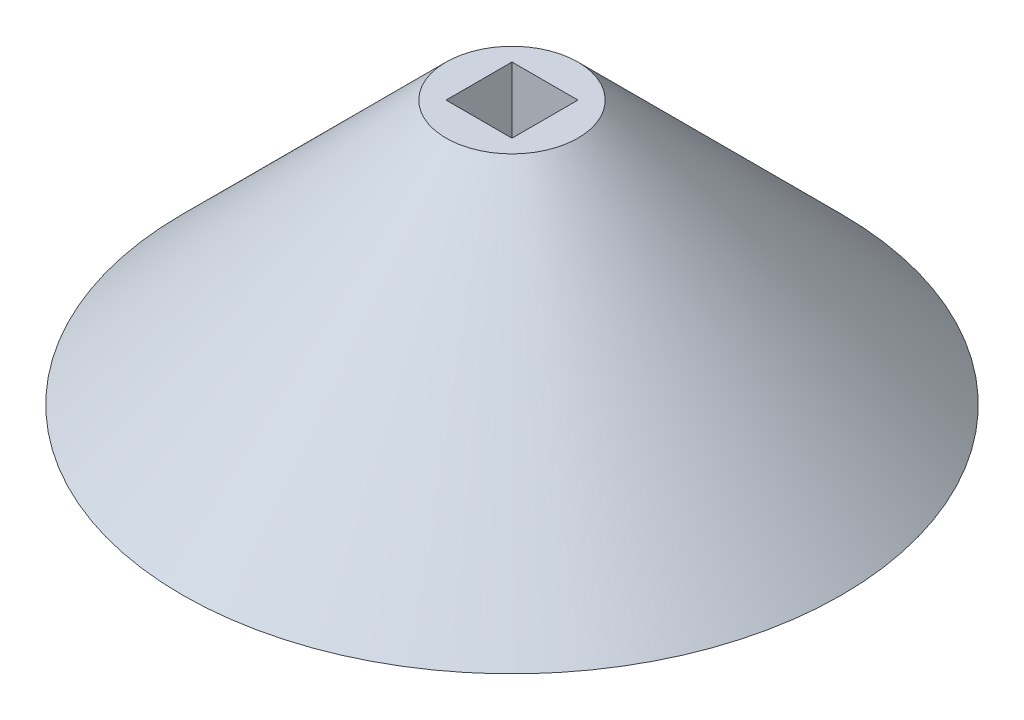
ISO-10303-21;
HEADER;
FILE_DESCRIPTION(('STEP AP214'),'2;1');
FILE_NAME('part.step','',(''),(''),'','','');
FILE_SCHEMA(('AUTOMOTIVE_DESIGN { 1 0 10303 214 1 1 1 1 }'));
ENDSEC;
DATA;
#1=APPLICATION_CONTEXT('core data for automotive mechanical design processes');
#2=APPLICATION_PROTOCOL_DEFINITION('international standard','automotive_design',2000,#1);
#3=PRODUCT_CONTEXT('',#1,'mechanical');
#4=PRODUCT('Part','Part','',(#3));
#5=PRODUCT_RELATED_PRODUCT_CATEGORY('part','',(#4));
#6=PRODUCT_DEFINITION_FORMATION('','',#4);
#7=PRODUCT_DEFINITION_CONTEXT('part definition',#1,'design');
#8=PRODUCT_DEFINITION('design','',#6,#7);
#9=PRODUCT_DEFINITION_SHAPE('','',#8);
#10=(LENGTH_UNIT() NAMED_UNIT(*) SI_UNIT(.MILLI.,.METRE.));
#11=(NAMED_UNIT(*) PLANE_ANGLE_UNIT() SI_UNIT($,.RADIAN.));
#12=(NAMED_UNIT(*) SI_UNIT($,.STERADIAN.) SOLID_ANGLE_UNIT());
#13=UNCERTAINTY_MEASURE_WITH_UNIT(LENGTH_MEASURE(1.E-05),#10,'distance_accuracy_value','');
#14=(GEOMETRIC_REPRESENTATION_CONTEXT(3) GLOBAL_UNCERTAINTY_ASSIGNED_CONTEXT((#13)) GLOBAL_UNIT_ASSIGNED_CONTEXT((#10,
#11,#12)) REPRESENTATION_CONTEXT('',''));
#15=CARTESIAN_POINT('',(0.,0.,0.));
#16=DIRECTION('',(0.,0.,1.));
#17=DIRECTION('',(1.,0.,0.));
#18=AXIS2_PLACEMENT_3D('',#15,#16,#17);
#19=CARTESIAN_POINT('',(0.,20.,-5.));
#20=DIRECTION('',(0.,1.,0.));
#21=DIRECTION('',(0.,0.,1.));
#22=AXIS2_PLACEMENT_3D('',#19,#20,#21);
#23=PLANE('',#22);
#24=CARTESIAN_POINT('',(0.,20.,0.));
#25=DIRECTION('',(0.,-1.,0.));
#26=DIRECTION('',(0.,0.,-1.));
#27=AXIS2_PLACEMENT_3D('',#24,#25,#26);
#28=CIRCLE('',#27,5.);
#29=CARTESIAN_POINT('',(0.,20.,-5.));
#30=VERTEX_POINT('',#29);
#31=EDGE_CURVE('E48',#30,#30,#28,.T.);
#32=ORIENTED_EDGE('',*,*,#31,.F.);
#33=EDGE_LOOP('',(#32));
#34=FACE_BOUND('',#33,.T.);
#35=DIRECTION('',(-1.,0.,0.));
#36=VECTOR('',#35,1.);
#37=CARTESIAN_POINT('',(-2.5,20.,-2.5));
#38=LINE('',#37,#36);
#39=CARTESIAN_POINT('',(2.5,20.,-2.5));
#40=VERTEX_POINT('',#39);
#41=CARTESIAN_POINT('',(-2.5,20.,-2.5));
#42=VERTEX_POINT('',#41);
#43=EDGE_CURVE('E94',#40,#42,#38,.T.);
#44=ORIENTED_EDGE('',*,*,#43,.F.);
#45=DIRECTION('',(0.,0.,-1.));
#46=VECTOR('',#45,1.);
#47=CARTESIAN_POINT('',(2.5,20.,2.5));
#48=LINE('',#47,#46);
#49=CARTESIAN_POINT('',(2.5,20.,2.5));
#50=VERTEX_POINT('',#49);
#51=EDGE_CURVE('E86',#50,#40,#48,.T.);
#52=ORIENTED_EDGE('',*,*,#51,.F.);
#53=DIRECTION('',(1.,0.,0.));
#54=VECTOR('',#53,1.);
#55=CARTESIAN_POINT('',(-2.5,20.,2.5));
#56=LINE('',#55,#54);
#57=CARTESIAN_POINT('',(-2.5,20.,2.5));
#58=VERTEX_POINT('',#57);
#59=EDGE_CURVE('E62',#58,#50,#56,.T.);
#60=ORIENTED_EDGE('',*,*,#59,.F.);
#61=DIRECTION('',(0.,0.,1.));
#62=VECTOR('',#61,1.);
#63=CARTESIAN_POINT('',(-2.5,20.,2.5));
#64=LINE('',#63,#62);
#65=EDGE_CURVE('E105',#42,#58,#64,.T.);
#66=ORIENTED_EDGE('',*,*,#65,.F.);
#67=EDGE_LOOP('',(#44,#52,#60,#66));
#68=FACE_BOUND('',#67,.T.);
#69=ADVANCED_FACE('F39',(#34,#68),#23,.T.);
#70=CARTESIAN_POINT('',(0.,0.,0.));
#71=DIRECTION('',(0.,-1.,0.));
#72=DIRECTION('',(0.,0.,-1.));
#73=AXIS2_PLACEMENT_3D('',#70,#71,#72);
#74=PLANE('',#73);
#75=CARTESIAN_POINT('',(0.,0.,0.));
#76=DIRECTION('',(0.,1.,0.));
#77=DIRECTION('',(0.,0.,1.));
#78=AXIS2_PLACEMENT_3D('',#75,#76,#77);
#79=CIRCLE('',#78,13.1);
#80=CARTESIAN_POINT('',(0.,0.,13.1));
#81=VERTEX_POINT('',#80);
#82=EDGE_CURVE('E155',#81,#81,#79,.T.);
#83=ORIENTED_EDGE('',*,*,#82,.T.);
#84=EDGE_LOOP('',(#83));
#85=FACE_BOUND('',#84,.T.);
#86=CARTESIAN_POINT('',(0.,0.,0.));
#87=DIRECTION('',(0.,-1.,0.));
#88=DIRECTION('',(0.,0.,-1.));
#89=AXIS2_PLACEMENT_3D('',#86,#87,#88);
#90=CIRCLE('',#89,25.);
#91=CARTESIAN_POINT('',(0.,0.,-25.));
#92=VERTEX_POINT('',#91);
#93=EDGE_CURVE('E11',#92,#92,#90,.T.);
#94=ORIENTED_EDGE('',*,*,#93,.T.);
#95=EDGE_LOOP('',(#94));
#96=FACE_BOUND('',#95,.T.);
#97=ADVANCED_FACE('F41',(#85,#96),#74,.T.);
#98=CARTESIAN_POINT('',(0.,0.,0.));
#99=DIRECTION('',(0.,-1.,0.));
#100=DIRECTION('',(0.,0.,-1.));
#101=AXIS2_PLACEMENT_3D('',#98,#99,#100);
#102=CONICAL_SURFACE('',#101,25.,0.785398163397448);
#103=CARTESIAN_POINT('',(0.,20.,-5.));
#104=CARTESIAN_POINT('',(0.,19.7916666666667,-5.20833333333333));
#105=CARTESIAN_POINT('',(0.,19.5833333333333,-5.41666666666666));
#106=CARTESIAN_POINT('',(0.,19.1666666666667,-5.83333333333333));
#107=CARTESIAN_POINT('',(0.,18.9583333333333,-6.04166666666667));
#108=CARTESIAN_POINT('',(0.,18.5416666666667,-6.45833333333333));
#109=CARTESIAN_POINT('',(0.,18.3333333333333,-6.66666666666667));
#110=CARTESIAN_POINT('',(0.,17.9166666666667,-7.08333333333333));
#111=CARTESIAN_POINT('',(0.,17.7083333333333,-7.29166666666667));
#112=CARTESIAN_POINT('',(0.,17.2916666666667,-7.70833333333333));
#113=CARTESIAN_POINT('',(0.,17.0833333333333,-7.91666666666666));
#114=CARTESIAN_POINT('',(0.,16.6666666666667,-8.33333333333333));
#115=CARTESIAN_POINT('',(0.,16.4583333333333,-8.54166666666666));
#116=CARTESIAN_POINT('',(0.,16.0416666666667,-8.95833333333333));
#117=CARTESIAN_POINT('',(0.,15.8333333333333,-9.16666666666666));
#118=CARTESIAN_POINT('',(0.,15.4166666666667,-9.58333333333333));
#119=CARTESIAN_POINT('',(0.,15.2083333333333,-9.79166666666667));
#120=CARTESIAN_POINT('',(0.,14.7916666666667,-10.2083333333333));
#121=CARTESIAN_POINT('',(0.,14.5833333333333,-10.4166666666667));
#122=CARTESIAN_POINT('',(0.,14.1666666666667,-10.8333333333333));
#123=CARTESIAN_POINT('',(0.,13.9583333333333,-11.0416666666667));
#124=CARTESIAN_POINT('',(0.,13.5416666666667,-11.4583333333333));
#125=CARTESIAN_POINT('',(0.,13.3333333333333,-11.6666666666667));
#126=CARTESIAN_POINT('',(0.,12.9166666666667,-12.0833333333333));
#127=CARTESIAN_POINT('',(0.,12.7083333333333,-12.2916666666667));
#128=CARTESIAN_POINT('',(0.,12.2916666666667,-12.7083333333333));
#129=CARTESIAN_POINT('',(0.,12.0833333333333,-12.9166666666667));
#130=CARTESIAN_POINT('',(0.,11.6666666666667,-13.3333333333333));
#131=CARTESIAN_POINT('',(0.,11.4583333333333,-13.5416666666667));
#132=CARTESIAN_POINT('',(0.,11.0416666666667,-13.9583333333333));
#133=CARTESIAN_POINT('',(0.,10.8333333333333,-14.1666666666667));
#134=CARTESIAN_POINT('',(0.,10.4166666666667,-14.5833333333333));
#135=CARTESIAN_POINT('',(0.,10.2083333333333,-14.7916666666667));
#136=CARTESIAN_POINT('',(0.,9.79166666666667,-15.2083333333333));
#137=CARTESIAN_POINT('',(0.,9.58333333333333,-15.4166666666667));
#138=CARTESIAN_POINT('',(0.,9.16666666666667,-15.8333333333333));
#139=CARTESIAN_POINT('',(0.,8.95833333333333,-16.0416666666667));
#140=CARTESIAN_POINT('',(0.,8.54166666666667,-16.4583333333333));
#141=CARTESIAN_POINT('',(0.,8.33333333333334,-16.6666666666667));
#142=CARTESIAN_POINT('',(0.,7.91666666666667,-17.0833333333333));
#143=CARTESIAN_POINT('',(0.,7.70833333333334,-17.2916666666667));
#144=CARTESIAN_POINT('',(0.,7.29166666666667,-17.7083333333333));
#145=CARTESIAN_POINT('',(0.,7.08333333333333,-17.9166666666667));
#146=CARTESIAN_POINT('',(0.,6.66666666666667,-18.3333333333333));
#147=CARTESIAN_POINT('',(0.,6.45833333333333,-18.5416666666667));
#148=CARTESIAN_POINT('',(0.,6.04166666666667,-18.9583333333333));
#149=CARTESIAN_POINT('',(0.,5.83333333333334,-19.1666666666667));
#150=CARTESIAN_POINT('',(0.,5.41666666666667,-19.5833333333333));
#151=CARTESIAN_POINT('',(0.,5.20833333333333,-19.7916666666667));
#152=CARTESIAN_POINT('',(0.,4.79166666666667,-20.2083333333333));
#153=CARTESIAN_POINT('',(0.,4.58333333333333,-20.4166666666667));
#154=CARTESIAN_POINT('',(0.,4.16666666666667,-20.8333333333333));
#155=CARTESIAN_POINT('',(0.,3.95833333333333,-21.0416666666667));
#156=CARTESIAN_POINT('',(0.,3.54166666666667,-21.4583333333333));
#157=CARTESIAN_POINT('',(0.,3.33333333333333,-21.6666666666667));
#158=CARTESIAN_POINT('',(0.,2.91666666666667,-22.0833333333333));
#159=CARTESIAN_POINT('',(0.,2.70833333333333,-22.2916666666667));
#160=CARTESIAN_POINT('',(0.,2.29166666666667,-22.7083333333333));
#161=CARTESIAN_POINT('',(0.,2.08333333333334,-22.9166666666667));
#162=CARTESIAN_POINT('',(0.,1.66666666666667,-23.3333333333333));
#163=CARTESIAN_POINT('',(0.,1.45833333333333,-23.5416666666667));
#164=CARTESIAN_POINT('',(0.,1.04166666666667,-23.9583333333333));
#165=CARTESIAN_POINT('',(0.,0.833333333333334,-24.1666666666667));
#166=CARTESIAN_POINT('',(0.,0.416666666666667,-24.5833333333333));
#167=CARTESIAN_POINT('',(0.,0.208333333333333,-24.7916666666667));
#168=CARTESIAN_POINT('',(0.,0.,-25.));
#169=B_SPLINE_CURVE_WITH_KNOTS('',3,(#103,#104,#105,#106,#107,#108,#109,#110,#111,#112,#113,
#114,#115,#116,#117,#118,#119,#120,#121,#122,#123,#124,#125,#126,#127,#128,#129,#130,#131,#132,
#133,#134,#135,#136,#137,#138,#139,#140,#141,#142,#143,#144,#145,#146,#147,#148,#149,#150,#151,
#152,#153,#154,#155,#156,#157,#158,#159,#160,#161,#162,#163,#164,#165,#166,#167,#168),
.UNSPECIFIED.,.F.,.F.,(4,2,2,2,2,2,2,2,2,2,2,2,2,2,2,2,2,2,2,2,2,2,2,2,2,2,2,2,2,2,2,2,4),(0.,
0.883883476483185,1.76776695296637,2.65165042944956,3.53553390593274,4.41941738241592,
5.30330085889911,6.18718433538229,7.07106781186548,7.95495128834866,8.83883476483185,
9.72271824131503,10.6066017177982,11.4904851942814,12.3743686707646,13.2582521472478,
14.142135623731,15.0260191002141,15.9099025766973,16.7937860531805,17.6776695296637,
18.5615530061469,19.4454364826301,20.3293199591132,21.2132034355964,22.0970869120796,
22.9809703885628,23.864853865046,24.7487373415292,25.6326208180123,26.5165042944955,
27.4003877709787,28.2842712474619),.UNSPECIFIED.);
#170=EDGE_CURVE('BSEAM128',#30,#92,#169,.T.);
#171=ORIENTED_EDGE('',*,*,#31,.T.);
#172=ORIENTED_EDGE('',*,*,#93,.F.);
#173=ORIENTED_EDGE('',*,*,#170,.T.);
#174=ORIENTED_EDGE('',*,*,#170,.F.);
#175=EDGE_LOOP('',(#171,#173,#172,#174));
#176=FACE_BOUND('',#175,.T.);
#177=ADVANCED_FACE('F128',(#176),#102,.T.);
#178=CARTESIAN_POINT('',(0.,20.,0.));
#179=DIRECTION('',(0.,-1.,0.));
#180=DIRECTION('',(0.,0.,-1.));
#181=AXIS2_PLACEMENT_3D('',#178,#179,#180);
#182=CYLINDRICAL_SURFACE('',#181,1.5);
#183=CARTESIAN_POINT('',(0.,7.9,0.));
#184=DIRECTION('',(0.,1.,0.));
#185=DIRECTION('',(0.,0.,1.));
#186=AXIS2_PLACEMENT_3D('',#183,#184,#185);
#187=CIRCLE('',#186,1.5);
#188=CARTESIAN_POINT('',(0.,7.9,1.5));
#189=VERTEX_POINT('',#188);
#190=EDGE_CURVE('E43',#189,#189,#187,.T.);
#191=ORIENTED_EDGE('',*,*,#190,.F.);
#192=EDGE_LOOP('',(#191));
#193=FACE_BOUND('',#192,.T.);
#194=CARTESIAN_POINT('',(0.,10.,0.));
#195=DIRECTION('',(0.,-1.,0.));
#196=DIRECTION('',(0.,0.,-1.));
#197=AXIS2_PLACEMENT_3D('',#194,#195,#196);
#198=CIRCLE('',#197,1.5);
#199=CARTESIAN_POINT('',(0.,10.,-1.5));
#200=VERTEX_POINT('',#199);
#201=EDGE_CURVE('E101',#200,#200,#198,.T.);
#202=ORIENTED_EDGE('',*,*,#201,.F.);
#203=EDGE_LOOP('',(#202));
#204=FACE_BOUND('',#203,.T.);
#205=ADVANCED_FACE('F126',(#193,#204),#182,.F.);
#206=CARTESIAN_POINT('',(2.5,20.,2.5));
#207=DIRECTION('',(-1.,0.,0.));
#208=DIRECTION('',(0.,0.,1.));
#209=AXIS2_PLACEMENT_3D('',#206,#207,#208);
#210=PLANE('',#209);
#211=DIRECTION('',(0.,0.,-1.));
#212=VECTOR('',#211,1.);
#213=CARTESIAN_POINT('',(2.5,10.,2.5));
#214=LINE('',#213,#212);
#215=CARTESIAN_POINT('',(2.5,10.,2.5));
#216=VERTEX_POINT('',#215);
#217=CARTESIAN_POINT('',(2.5,10.,-2.5));
#218=VERTEX_POINT('',#217);
#219=EDGE_CURVE('E111',#216,#218,#214,.T.);
#220=ORIENTED_EDGE('',*,*,#219,.F.);
#221=DIRECTION('',(0.,-1.,0.));
#222=VECTOR('',#221,1.);
#223=CARTESIAN_POINT('',(2.5,20.,2.5));
#224=LINE('',#223,#222);
#225=EDGE_CURVE('E91',#50,#216,#224,.T.);
#226=ORIENTED_EDGE('',*,*,#225,.F.);
#227=ORIENTED_EDGE('',*,*,#51,.T.);
#228=DIRECTION('',(0.,-1.,0.));
#229=VECTOR('',#228,1.);
#230=CARTESIAN_POINT('',(2.5,20.,-2.5));
#231=LINE('',#230,#229);
#232=EDGE_CURVE('E90',#40,#218,#231,.T.);
#233=ORIENTED_EDGE('',*,*,#232,.T.);
#234=EDGE_LOOP('',(#220,#226,#227,#233));
#235=FACE_BOUND('',#234,.T.);
#236=ADVANCED_FACE('F89',(#235),#210,.T.);
#237=CARTESIAN_POINT('',(-2.5,20.,-2.5));
#238=DIRECTION('',(0.,0.,1.));
#239=DIRECTION('',(1.,0.,0.));
#240=AXIS2_PLACEMENT_3D('',#237,#238,#239);
#241=PLANE('',#240);
#242=DIRECTION('',(-1.,0.,0.));
#243=VECTOR('',#242,1.);
#244=CARTESIAN_POINT('',(-2.5,10.,-2.5));
#245=LINE('',#244,#243);
#246=CARTESIAN_POINT('',(-2.5,10.,-2.5));
#247=VERTEX_POINT('',#246);
#248=EDGE_CURVE('E100',#218,#247,#245,.T.);
#249=ORIENTED_EDGE('',*,*,#248,.F.);
#250=ORIENTED_EDGE('',*,*,#232,.F.);
#251=ORIENTED_EDGE('',*,*,#43,.T.);
#252=DIRECTION('',(0.,-1.,0.));
#253=VECTOR('',#252,1.);
#254=CARTESIAN_POINT('',(-2.5,20.,-2.5));
#255=LINE('',#254,#253);
#256=EDGE_CURVE('E102',#42,#247,#255,.T.);
#257=ORIENTED_EDGE('',*,*,#256,.T.);
#258=EDGE_LOOP('',(#249,#250,#251,#257));
#259=FACE_BOUND('',#258,.T.);
#260=ADVANCED_FACE('F97',(#259),#241,.T.);
#261=CARTESIAN_POINT('',(-2.5,20.,2.5));
#262=DIRECTION('',(1.,0.,0.));
#263=DIRECTION('',(0.,0.,-1.));
#264=AXIS2_PLACEMENT_3D('',#261,#262,#263);
#265=PLANE('',#264);
#266=DIRECTION('',(0.,0.,1.));
#267=VECTOR('',#266,1.);
#268=CARTESIAN_POINT('',(-2.5,10.,2.5));
#269=LINE('',#268,#267);
#270=CARTESIAN_POINT('',(-2.5,10.,2.5));
#271=VERTEX_POINT('',#270);
#272=EDGE_CURVE('E114',#247,#271,#269,.T.);
#273=ORIENTED_EDGE('',*,*,#272,.F.);
#274=ORIENTED_EDGE('',*,*,#256,.F.);
#275=ORIENTED_EDGE('',*,*,#65,.T.);
#276=DIRECTION('',(0.,-1.,0.));
#277=VECTOR('',#276,1.);
#278=CARTESIAN_POINT('',(-2.5,20.,2.5));
#279=LINE('',#278,#277);
#280=EDGE_CURVE('E56',#58,#271,#279,.T.);
#281=ORIENTED_EDGE('',*,*,#280,.T.);
#282=EDGE_LOOP('',(#273,#274,#275,#281));
#283=FACE_BOUND('',#282,.T.);
#284=ADVANCED_FACE('F177',(#283),#265,.T.);
#285=CARTESIAN_POINT('',(-2.5,20.,2.5));
#286=DIRECTION('',(0.,0.,-1.));
#287=DIRECTION('',(-1.,0.,0.));
#288=AXIS2_PLACEMENT_3D('',#285,#286,#287);
#289=PLANE('',#288);
#290=DIRECTION('',(1.,0.,0.));
#291=VECTOR('',#290,1.);
#292=CARTESIAN_POINT('',(-2.5,10.,2.5));
#293=LINE('',#292,#291);
#294=EDGE_CURVE('E81',#271,#216,#293,.T.);
#295=ORIENTED_EDGE('',*,*,#294,.F.);
#296=ORIENTED_EDGE('',*,*,#280,.F.);
#297=ORIENTED_EDGE('',*,*,#59,.T.);
#298=ORIENTED_EDGE('',*,*,#225,.T.);
#299=EDGE_LOOP('',(#295,#296,#297,#298));
#300=FACE_BOUND('',#299,.T.);
#301=ADVANCED_FACE('F174',(#300),#289,.T.);
#302=CARTESIAN_POINT('',(0.,10.,0.));
#303=DIRECTION('',(0.,-1.,0.));
#304=DIRECTION('',(0.,0.,-1.));
#305=AXIS2_PLACEMENT_3D('',#302,#303,#304);
#306=PLANE('',#305);
#307=ORIENTED_EDGE('',*,*,#201,.T.);
#308=EDGE_LOOP('',(#307));
#309=FACE_BOUND('',#308,.T.);
#310=ORIENTED_EDGE('',*,*,#219,.T.);
#311=ORIENTED_EDGE('',*,*,#248,.T.);
#312=ORIENTED_EDGE('',*,*,#272,.T.);
#313=ORIENTED_EDGE('',*,*,#294,.T.);
#314=EDGE_LOOP('',(#310,#311,#312,#313));
#315=FACE_BOUND('',#314,.T.);
#316=ADVANCED_FACE('F124',(#309,#315),#306,.F.);
#317=CARTESIAN_POINT('',(0.,7.9,0.));
#318=DIRECTION('',(0.,-1.,0.));
#319=DIRECTION('',(0.,0.,-1.));
#320=AXIS2_PLACEMENT_3D('',#317,#318,#319);
#321=CYLINDRICAL_SURFACE('',#320,13.1);
#322=CARTESIAN_POINT('',(0.,7.9,0.));
#323=DIRECTION('',(0.,1.,0.));
#324=DIRECTION('',(0.,0.,1.));
#325=AXIS2_PLACEMENT_3D('',#322,#323,#324);
#326=CIRCLE('',#325,13.1);
#327=CARTESIAN_POINT('',(0.,7.9,13.1));
#328=VERTEX_POINT('',#327);
#329=EDGE_CURVE('E157',#328,#328,#326,.T.);
#330=ORIENTED_EDGE('',*,*,#329,.T.);
#331=EDGE_LOOP('',(#330));
#332=FACE_BOUND('',#331,.T.);
#333=ORIENTED_EDGE('',*,*,#82,.F.);
#334=EDGE_LOOP('',(#333));
#335=FACE_BOUND('',#334,.T.);
#336=ADVANCED_FACE('F167',(#332,#335),#321,.F.);
#337=CARTESIAN_POINT('',(0.,7.9,0.));
#338=DIRECTION('',(0.,1.,0.));
#339=DIRECTION('',(0.,0.,1.));
#340=AXIS2_PLACEMENT_3D('',#337,#338,#339);
#341=PLANE('',#340);
#342=ORIENTED_EDGE('',*,*,#190,.T.);
#343=EDGE_LOOP('',(#342));
#344=FACE_BOUND('',#343,.T.);
#345=ORIENTED_EDGE('',*,*,#329,.F.);
#346=EDGE_LOOP('',(#345));
#347=FACE_BOUND('',#346,.T.);
#348=ADVANCED_FACE('F164',(#344,#347),#341,.F.);
#349=CLOSED_SHELL('',(#69,#97,#177,#205,#236,#260,#284,#301,#316,#336,#348));
#350=MANIFOLD_SOLID_BREP('B2',#349);
#351=ADVANCED_BREP_SHAPE_REPRESENTATION('',(#18,#350),#14);
#352=SHAPE_DEFINITION_REPRESENTATION(#9,#351);
ENDSEC;
END-ISO-10303-21;
